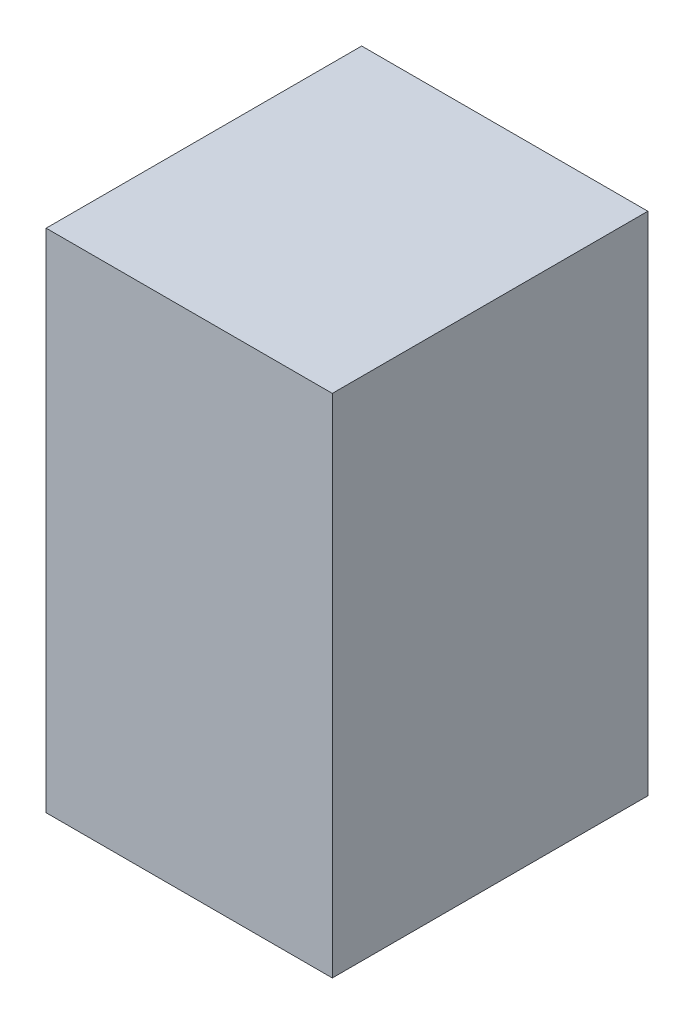
ISO-10303-21;
HEADER;
FILE_DESCRIPTION(('STEP AP214'),'2;1');
FILE_NAME('part.step','',(''),(''),'','','');
FILE_SCHEMA(('AUTOMOTIVE_DESIGN { 1 0 10303 214 1 1 1 1 }'));
ENDSEC;
DATA;
#1=APPLICATION_CONTEXT('core data for automotive mechanical design processes');
#2=APPLICATION_PROTOCOL_DEFINITION('international standard','automotive_design',2000,#1);
#3=PRODUCT_CONTEXT('',#1,'mechanical');
#4=PRODUCT('Part','Part','',(#3));
#5=PRODUCT_RELATED_PRODUCT_CATEGORY('part','',(#4));
#6=PRODUCT_DEFINITION_FORMATION('','',#4);
#7=PRODUCT_DEFINITION_CONTEXT('part definition',#1,'design');
#8=PRODUCT_DEFINITION('design','',#6,#7);
#9=PRODUCT_DEFINITION_SHAPE('','',#8);
#10=(LENGTH_UNIT() NAMED_UNIT(*) SI_UNIT(.MILLI.,.METRE.));
#11=(NAMED_UNIT(*) PLANE_ANGLE_UNIT() SI_UNIT($,.RADIAN.));
#12=(NAMED_UNIT(*) SI_UNIT($,.STERADIAN.) SOLID_ANGLE_UNIT());
#13=UNCERTAINTY_MEASURE_WITH_UNIT(LENGTH_MEASURE(1.E-05),#10,'distance_accuracy_value','');
#14=(GEOMETRIC_REPRESENTATION_CONTEXT(3) GLOBAL_UNCERTAINTY_ASSIGNED_CONTEXT((#13)) GLOBAL_UNIT_ASSIGNED_CONTEXT((#10,
#11,#12)) REPRESENTATION_CONTEXT('',''));
#15=CARTESIAN_POINT('',(0.,0.,0.));
#16=DIRECTION('',(0.,0.,1.));
#17=DIRECTION('',(1.,0.,0.));
#18=AXIS2_PLACEMENT_3D('',#15,#16,#17);
#19=CARTESIAN_POINT('',(-22.6515602948094,29.75,43.));
#20=DIRECTION('',(1.,0.,0.));
#21=DIRECTION('',(0.,1.,0.));
#22=AXIS2_PLACEMENT_3D('',#19,#20,#21);
#23=PLANE('',#22);
#24=DIRECTION('',(0.,-1.,0.));
#25=VECTOR('',#24,1.);
#26=CARTESIAN_POINT('',(-22.6515602948094,29.75,0.));
#27=LINE('',#26,#25);
#28=CARTESIAN_POINT('',(-22.6515602948094,29.75,0.));
#29=VERTEX_POINT('',#28);
#30=CARTESIAN_POINT('',(-22.6515602948094,-39.25,0.));
#31=VERTEX_POINT('',#30);
#32=EDGE_CURVE('E96',#29,#31,#27,.T.);
#33=ORIENTED_EDGE('',*,*,#32,.T.);
#34=DIRECTION('',(0.,0.,-1.));
#35=VECTOR('',#34,1.);
#36=CARTESIAN_POINT('',(-22.6515602948094,-39.25,43.));
#37=LINE('',#36,#35);
#38=CARTESIAN_POINT('',(-22.6515602948094,-39.25,43.));
#39=VERTEX_POINT('',#38);
#40=EDGE_CURVE('E11',#39,#31,#37,.T.);
#41=ORIENTED_EDGE('',*,*,#40,.F.);
#42=DIRECTION('',(0.,-1.,0.));
#43=VECTOR('',#42,1.);
#44=CARTESIAN_POINT('',(-22.6515602948094,29.75,43.));
#45=LINE('',#44,#43);
#46=CARTESIAN_POINT('',(-22.6515602948094,29.75,43.));
#47=VERTEX_POINT('',#46);
#48=EDGE_CURVE('E84',#47,#39,#45,.T.);
#49=ORIENTED_EDGE('',*,*,#48,.F.);
#50=DIRECTION('',(0.,0.,-1.));
#51=VECTOR('',#50,1.);
#52=CARTESIAN_POINT('',(-22.6515602948094,29.75,43.));
#53=LINE('',#52,#51);
#54=EDGE_CURVE('E92',#47,#29,#53,.T.);
#55=ORIENTED_EDGE('',*,*,#54,.T.);
#56=EDGE_LOOP('',(#33,#41,#49,#55));
#57=FACE_BOUND('',#56,.T.);
#58=ADVANCED_FACE('F33',(#57),#23,.F.);
#59=CARTESIAN_POINT('',(-22.6515602948094,-39.25,43.));
#60=DIRECTION('',(0.,1.,0.));
#61=DIRECTION('',(0.,0.,1.));
#62=AXIS2_PLACEMENT_3D('',#59,#60,#61);
#63=PLANE('',#62);
#64=DIRECTION('',(1.,0.,0.));
#65=VECTOR('',#64,1.);
#66=CARTESIAN_POINT('',(-22.6515602948094,-39.25,0.));
#67=LINE('',#66,#65);
#68=CARTESIAN_POINT('',(16.3484397051906,-39.25,0.));
#69=VERTEX_POINT('',#68);
#70=EDGE_CURVE('E88',#31,#69,#67,.T.);
#71=ORIENTED_EDGE('',*,*,#70,.T.);
#72=DIRECTION('',(0.,0.,-1.));
#73=VECTOR('',#72,1.);
#74=CARTESIAN_POINT('',(16.3484397051906,-39.25,43.));
#75=LINE('',#74,#73);
#76=CARTESIAN_POINT('',(16.3484397051906,-39.25,43.));
#77=VERTEX_POINT('',#76);
#78=EDGE_CURVE('E41',#77,#69,#75,.T.);
#79=ORIENTED_EDGE('',*,*,#78,.F.);
#80=DIRECTION('',(1.,0.,0.));
#81=VECTOR('',#80,1.);
#82=CARTESIAN_POINT('',(-22.6515602948094,-39.25,43.));
#83=LINE('',#82,#81);
#84=EDGE_CURVE('E79',#39,#77,#83,.T.);
#85=ORIENTED_EDGE('',*,*,#84,.F.);
#86=ORIENTED_EDGE('',*,*,#40,.T.);
#87=EDGE_LOOP('',(#71,#79,#85,#86));
#88=FACE_BOUND('',#87,.T.);
#89=ADVANCED_FACE('F87',(#88),#63,.F.);
#90=CARTESIAN_POINT('',(16.3484397051906,29.75,43.));
#91=DIRECTION('',(-1.,0.,0.));
#92=DIRECTION('',(0.,-1.,0.));
#93=AXIS2_PLACEMENT_3D('',#90,#91,#92);
#94=PLANE('',#93);
#95=DIRECTION('',(0.,1.,0.));
#96=VECTOR('',#95,1.);
#97=CARTESIAN_POINT('',(16.3484397051906,29.75,0.));
#98=LINE('',#97,#96);
#99=CARTESIAN_POINT('',(16.3484397051906,29.75,0.));
#100=VERTEX_POINT('',#99);
#101=EDGE_CURVE('E66',#69,#100,#98,.T.);
#102=ORIENTED_EDGE('',*,*,#101,.T.);
#103=DIRECTION('',(0.,0.,-1.));
#104=VECTOR('',#103,1.);
#105=CARTESIAN_POINT('',(16.3484397051906,29.75,43.));
#106=LINE('',#105,#104);
#107=CARTESIAN_POINT('',(16.3484397051906,29.75,43.));
#108=VERTEX_POINT('',#107);
#109=EDGE_CURVE('E89',#108,#100,#106,.T.);
#110=ORIENTED_EDGE('',*,*,#109,.F.);
#111=DIRECTION('',(0.,1.,0.));
#112=VECTOR('',#111,1.);
#113=CARTESIAN_POINT('',(16.3484397051906,29.75,43.));
#114=LINE('',#113,#112);
#115=EDGE_CURVE('E82',#77,#108,#114,.T.);
#116=ORIENTED_EDGE('',*,*,#115,.F.);
#117=ORIENTED_EDGE('',*,*,#78,.T.);
#118=EDGE_LOOP('',(#102,#110,#116,#117));
#119=FACE_BOUND('',#118,.T.);
#120=ADVANCED_FACE('F90',(#119),#94,.F.);
#121=CARTESIAN_POINT('',(-22.6515602948094,29.75,43.));
#122=DIRECTION('',(0.,-1.,0.));
#123=DIRECTION('',(0.,0.,-1.));
#124=AXIS2_PLACEMENT_3D('',#121,#122,#123);
#125=PLANE('',#124);
#126=DIRECTION('',(-1.,0.,0.));
#127=VECTOR('',#126,1.);
#128=CARTESIAN_POINT('',(-22.6515602948094,29.75,0.));
#129=LINE('',#128,#127);
#130=EDGE_CURVE('E72',#100,#29,#129,.T.);
#131=ORIENTED_EDGE('',*,*,#130,.T.);
#132=ORIENTED_EDGE('',*,*,#54,.F.);
#133=DIRECTION('',(-1.,0.,0.));
#134=VECTOR('',#133,1.);
#135=CARTESIAN_POINT('',(-22.6515602948094,29.75,43.));
#136=LINE('',#135,#134);
#137=EDGE_CURVE('E49',#108,#47,#136,.T.);
#138=ORIENTED_EDGE('',*,*,#137,.F.);
#139=ORIENTED_EDGE('',*,*,#109,.T.);
#140=EDGE_LOOP('',(#131,#132,#138,#139));
#141=FACE_BOUND('',#140,.T.);
#142=ADVANCED_FACE('F103',(#141),#125,.F.);
#143=CARTESIAN_POINT('',(0.,0.,43.));
#144=DIRECTION('',(0.,0.,1.));
#145=DIRECTION('',(1.,0.,0.));
#146=AXIS2_PLACEMENT_3D('',#143,#144,#145);
#147=PLANE('',#146);
#148=ORIENTED_EDGE('',*,*,#48,.T.);
#149=ORIENTED_EDGE('',*,*,#84,.T.);
#150=ORIENTED_EDGE('',*,*,#115,.T.);
#151=ORIENTED_EDGE('',*,*,#137,.T.);
#152=EDGE_LOOP('',(#148,#149,#150,#151));
#153=FACE_BOUND('',#152,.T.);
#154=ADVANCED_FACE('F80',(#153),#147,.T.);
#155=CARTESIAN_POINT('',(0.,0.,0.));
#156=DIRECTION('',(0.,0.,1.));
#157=DIRECTION('',(1.,0.,0.));
#158=AXIS2_PLACEMENT_3D('',#155,#156,#157);
#159=PLANE('',#158);
#160=ORIENTED_EDGE('',*,*,#32,.F.);
#161=ORIENTED_EDGE('',*,*,#130,.F.);
#162=ORIENTED_EDGE('',*,*,#101,.F.);
#163=ORIENTED_EDGE('',*,*,#70,.F.);
#164=EDGE_LOOP('',(#160,#161,#162,#163));
#165=FACE_BOUND('',#164,.T.);
#166=ADVANCED_FACE('F106',(#165),#159,.F.);
#167=CLOSED_SHELL('',(#58,#89,#120,#142,#154,#166));
#168=MANIFOLD_SOLID_BREP('B2',#167);
#169=ADVANCED_BREP_SHAPE_REPRESENTATION('',(#18,#168),#14);
#170=SHAPE_DEFINITION_REPRESENTATION(#9,#169);
ENDSEC;
END-ISO-10303-21;
